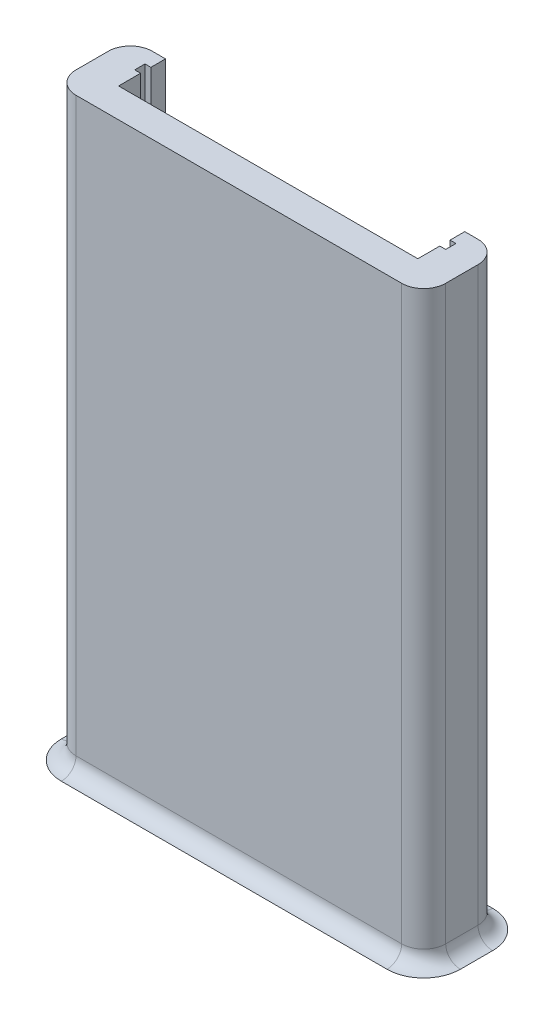
ISO-10303-21;
HEADER;
FILE_DESCRIPTION(('STEP AP214'),'2;1');
FILE_NAME('part.step','',(''),(''),'','','');
FILE_SCHEMA(('AUTOMOTIVE_DESIGN { 1 0 10303 214 1 1 1 1 }'));
ENDSEC;
DATA;
#1=APPLICATION_CONTEXT('core data for automotive mechanical design processes');
#2=APPLICATION_PROTOCOL_DEFINITION('international standard','automotive_design',2000,#1);
#3=PRODUCT_CONTEXT('',#1,'mechanical');
#4=PRODUCT('Part','Part','',(#3));
#5=PRODUCT_RELATED_PRODUCT_CATEGORY('part','',(#4));
#6=PRODUCT_DEFINITION_FORMATION('','',#4);
#7=PRODUCT_DEFINITION_CONTEXT('part definition',#1,'design');
#8=PRODUCT_DEFINITION('design','',#6,#7);
#9=PRODUCT_DEFINITION_SHAPE('','',#8);
#10=(LENGTH_UNIT() NAMED_UNIT(*) SI_UNIT(.MILLI.,.METRE.));
#11=(NAMED_UNIT(*) PLANE_ANGLE_UNIT() SI_UNIT($,.RADIAN.));
#12=(NAMED_UNIT(*) SI_UNIT($,.STERADIAN.) SOLID_ANGLE_UNIT());
#13=UNCERTAINTY_MEASURE_WITH_UNIT(LENGTH_MEASURE(1.E-05),#10,'distance_accuracy_value','');
#14=(GEOMETRIC_REPRESENTATION_CONTEXT(3) GLOBAL_UNCERTAINTY_ASSIGNED_CONTEXT((#13)) GLOBAL_UNIT_ASSIGNED_CONTEXT((#10,
#11,#12)) REPRESENTATION_CONTEXT('',''));
#15=CARTESIAN_POINT('',(0.,0.,0.));
#16=DIRECTION('',(0.,0.,1.));
#17=DIRECTION('',(1.,0.,0.));
#18=AXIS2_PLACEMENT_3D('',#15,#16,#17);
#19=CARTESIAN_POINT('',(0.,107.5944,0.));
#20=DIRECTION('',(0.,1.,0.));
#21=DIRECTION('',(0.,0.,1.));
#22=AXIS2_PLACEMENT_3D('',#19,#20,#21);
#23=PLANE('',#22);
#24=DIRECTION('',(0.,0.,1.));
#25=VECTOR('',#24,1.);
#26=CARTESIAN_POINT('',(12.446,107.5944,0.));
#27=LINE('',#26,#25);
#28=CARTESIAN_POINT('',(12.446,107.5944,-11.938));
#29=VERTEX_POINT('',#28);
#30=CARTESIAN_POINT('',(12.446,107.5944,-6.35));
#31=VERTEX_POINT('',#30);
#32=EDGE_CURVE('E868',#29,#31,#27,.T.);
#33=ORIENTED_EDGE('',*,*,#32,.T.);
#34=CARTESIAN_POINT('',(16.256,107.5944,-6.35));
#35=DIRECTION('',(0.,1.,0.));
#36=DIRECTION('',(0.,0.,1.));
#37=AXIS2_PLACEMENT_3D('',#34,#35,#36);
#38=CIRCLE('',#37,3.81);
#39=CARTESIAN_POINT('',(16.256,107.5944,-2.54));
#40=VERTEX_POINT('',#39);
#41=EDGE_CURVE('E418',#31,#40,#38,.T.);
#42=ORIENTED_EDGE('',*,*,#41,.T.);
#43=DIRECTION('',(1.,0.,0.));
#44=VECTOR('',#43,1.);
#45=CARTESIAN_POINT('',(0.,107.5944,-2.54));
#46=LINE('',#45,#44);
#47=CARTESIAN_POINT('',(72.644,107.5944,-2.54));
#48=VERTEX_POINT('',#47);
#49=EDGE_CURVE('E895',#40,#48,#46,.T.);
#50=ORIENTED_EDGE('',*,*,#49,.T.);
#51=CARTESIAN_POINT('',(72.644,107.5944,-6.35));
#52=DIRECTION('',(0.,1.,0.));
#53=DIRECTION('',(0.,0.,1.));
#54=AXIS2_PLACEMENT_3D('',#51,#52,#53);
#55=CIRCLE('',#54,3.81);
#56=CARTESIAN_POINT('',(76.454,107.5944,-6.35));
#57=VERTEX_POINT('',#56);
#58=EDGE_CURVE('E412',#48,#57,#55,.T.);
#59=ORIENTED_EDGE('',*,*,#58,.T.);
#60=DIRECTION('',(0.,0.,1.));
#61=VECTOR('',#60,1.);
#62=CARTESIAN_POINT('',(76.454,107.5944,0.));
#63=LINE('',#62,#61);
#64=CARTESIAN_POINT('',(76.454,107.5944,-11.938));
#65=VERTEX_POINT('',#64);
#66=EDGE_CURVE('E898',#65,#57,#63,.T.);
#67=ORIENTED_EDGE('',*,*,#66,.F.);
#68=CARTESIAN_POINT('',(72.644,107.5944,-11.938));
#69=DIRECTION('',(0.,1.,0.));
#70=DIRECTION('',(0.,0.,1.));
#71=AXIS2_PLACEMENT_3D('',#68,#69,#70);
#72=CIRCLE('',#71,3.81);
#73=CARTESIAN_POINT('',(72.644,107.5944,-15.748));
#74=VERTEX_POINT('',#73);
#75=EDGE_CURVE('E409',#65,#74,#72,.T.);
#76=ORIENTED_EDGE('',*,*,#75,.T.);
#77=DIRECTION('',(1.,0.,0.));
#78=VECTOR('',#77,1.);
#79=CARTESIAN_POINT('',(0.,107.5944,-15.748));
#80=LINE('',#79,#78);
#81=CARTESIAN_POINT('',(70.358,107.5944,-15.748));
#82=VERTEX_POINT('',#81);
#83=EDGE_CURVE('E892',#82,#74,#80,.T.);
#84=ORIENTED_EDGE('',*,*,#83,.F.);
#85=DIRECTION('',(0.,0.,-1.));
#86=VECTOR('',#85,1.);
#87=CARTESIAN_POINT('',(70.358,107.5944,0.));
#88=LINE('',#87,#86);
#89=CARTESIAN_POINT('',(70.358,107.5944,-13.208));
#90=VERTEX_POINT('',#89);
#91=EDGE_CURVE('E357',#90,#82,#88,.T.);
#92=ORIENTED_EDGE('',*,*,#91,.F.);
#93=DIRECTION('',(1.,0.,0.));
#94=VECTOR('',#93,1.);
#95=CARTESIAN_POINT('',(0.,107.5944,-13.208));
#96=LINE('',#95,#94);
#97=CARTESIAN_POINT('',(71.374,107.5944,-13.208));
#98=VERTEX_POINT('',#97);
#99=EDGE_CURVE('E876',#90,#98,#96,.T.);
#100=ORIENTED_EDGE('',*,*,#99,.T.);
#101=DIRECTION('',(0.,0.,1.));
#102=VECTOR('',#101,1.);
#103=CARTESIAN_POINT('',(71.374,107.5944,0.));
#104=LINE('',#103,#102);
#105=CARTESIAN_POINT('',(71.374,107.5944,-11.43));
#106=VERTEX_POINT('',#105);
#107=EDGE_CURVE('E919',#98,#106,#104,.T.);
#108=ORIENTED_EDGE('',*,*,#107,.T.);
#109=DIRECTION('',(1.,0.,0.));
#110=VECTOR('',#109,1.);
#111=CARTESIAN_POINT('',(0.,107.5944,-11.43));
#112=LINE('',#111,#110);
#113=CARTESIAN_POINT('',(70.358,107.5944,-11.43));
#114=VERTEX_POINT('',#113);
#115=EDGE_CURVE('E886',#114,#106,#112,.T.);
#116=ORIENTED_EDGE('',*,*,#115,.F.);
#117=CARTESIAN_POINT('',(70.358,107.5944,-7.62));
#118=VERTEX_POINT('',#117);
#119=EDGE_CURVE('E909',#118,#114,#88,.T.);
#120=ORIENTED_EDGE('',*,*,#119,.F.);
#121=DIRECTION('',(1.,0.,0.));
#122=VECTOR('',#121,1.);
#123=CARTESIAN_POINT('',(0.,107.5944,-7.62));
#124=LINE('',#123,#122);
#125=CARTESIAN_POINT('',(18.542,107.5944,-7.62));
#126=VERTEX_POINT('',#125);
#127=EDGE_CURVE('E913',#126,#118,#124,.T.);
#128=ORIENTED_EDGE('',*,*,#127,.F.);
#129=DIRECTION('',(0.,0.,-1.));
#130=VECTOR('',#129,1.);
#131=CARTESIAN_POINT('',(18.542,107.5944,0.));
#132=LINE('',#131,#130);
#133=CARTESIAN_POINT('',(18.542,107.5944,-11.43));
#134=VERTEX_POINT('',#133);
#135=EDGE_CURVE('E884',#126,#134,#132,.T.);
#136=ORIENTED_EDGE('',*,*,#135,.T.);
#137=CARTESIAN_POINT('',(17.526,107.5944,-11.43));
#138=VERTEX_POINT('',#137);
#139=EDGE_CURVE('E880',#138,#134,#112,.T.);
#140=ORIENTED_EDGE('',*,*,#139,.F.);
#141=DIRECTION('',(0.,0.,1.));
#142=VECTOR('',#141,1.);
#143=CARTESIAN_POINT('',(17.526,107.5944,0.));
#144=LINE('',#143,#142);
#145=CARTESIAN_POINT('',(17.526,107.5944,-13.208));
#146=VERTEX_POINT('',#145);
#147=EDGE_CURVE('E874',#146,#138,#144,.T.);
#148=ORIENTED_EDGE('',*,*,#147,.F.);
#149=CARTESIAN_POINT('',(18.542,107.5944,-13.208));
#150=VERTEX_POINT('',#149);
#151=EDGE_CURVE('E871',#146,#150,#96,.T.);
#152=ORIENTED_EDGE('',*,*,#151,.T.);
#153=CARTESIAN_POINT('',(18.542,107.5944,-15.748));
#154=VERTEX_POINT('',#153);
#155=EDGE_CURVE('E869',#150,#154,#132,.T.);
#156=ORIENTED_EDGE('',*,*,#155,.T.);
#157=CARTESIAN_POINT('',(16.256,107.5944,-15.748));
#158=VERTEX_POINT('',#157);
#159=EDGE_CURVE('E854',#158,#154,#80,.T.);
#160=ORIENTED_EDGE('',*,*,#159,.F.);
#161=CARTESIAN_POINT('',(16.256,107.5944,-11.938));
#162=DIRECTION('',(0.,1.,0.));
#163=DIRECTION('',(0.,0.,1.));
#164=AXIS2_PLACEMENT_3D('',#161,#162,#163);
#165=CIRCLE('',#164,3.81);
#166=EDGE_CURVE('E415',#158,#29,#165,.T.);
#167=ORIENTED_EDGE('',*,*,#166,.T.);
#168=EDGE_LOOP('',(#33,#42,#50,#59,#67,#76,#84,#92,#100,#108,#116,#120,#128,#136,#140,#148,#152,
#156,#160,#167));
#169=FACE_BOUND('',#168,.T.);
#170=ADVANCED_FACE('F46',(#169),#23,.T.);
#171=CARTESIAN_POINT('',(0.,107.5944,-15.748));
#172=DIRECTION('',(0.,0.,-1.));
#173=DIRECTION('',(-1.,0.,0.));
#174=AXIS2_PLACEMENT_3D('',#171,#172,#173);
#175=PLANE('',#174);
#176=DIRECTION('',(0.,-1.,0.));
#177=VECTOR('',#176,1.);
#178=CARTESIAN_POINT('',(72.644,107.5944,-15.748));
#179=LINE('',#178,#177);
#180=CARTESIAN_POINT('',(72.644,8.5344,-15.748));
#181=VERTEX_POINT('',#180);
#182=EDGE_CURVE('E430',#74,#181,#179,.T.);
#183=ORIENTED_EDGE('',*,*,#182,.T.);
#184=DIRECTION('',(1.,0.,0.));
#185=VECTOR('',#184,1.);
#186=CARTESIAN_POINT('',(0.,8.5344,-15.748));
#187=LINE('',#186,#185);
#188=CARTESIAN_POINT('',(70.358,8.5344,-15.748));
#189=VERTEX_POINT('',#188);
#190=EDGE_CURVE('E273',#181,#189,#187,.F.);
#191=ORIENTED_EDGE('',*,*,#190,.T.);
#192=DIRECTION('',(0.,-1.,0.));
#193=VECTOR('',#192,1.);
#194=CARTESIAN_POINT('',(70.358,107.5944,-15.748));
#195=LINE('',#194,#193);
#196=EDGE_CURVE('E356',#82,#189,#195,.T.);
#197=ORIENTED_EDGE('',*,*,#196,.F.);
#198=ORIENTED_EDGE('',*,*,#83,.T.);
#199=EDGE_LOOP('',(#183,#191,#197,#198));
#200=FACE_BOUND('',#199,.T.);
#201=ADVANCED_FACE('F454',(#200),#175,.T.);
#202=CARTESIAN_POINT('',(72.644,107.5944,-11.938));
#203=DIRECTION('',(0.,-1.,0.));
#204=DIRECTION('',(0.,0.,-1.));
#205=AXIS2_PLACEMENT_3D('',#202,#203,#204);
#206=CYLINDRICAL_SURFACE('',#205,3.81);
#207=DIRECTION('',(0.,-1.,0.));
#208=VECTOR('',#207,1.);
#209=CARTESIAN_POINT('',(76.454,107.5944,-11.938));
#210=LINE('',#209,#208);
#211=CARTESIAN_POINT('',(76.454,8.5344,-11.938));
#212=VERTEX_POINT('',#211);
#213=EDGE_CURVE('E424',#212,#65,#210,.F.);
#214=ORIENTED_EDGE('',*,*,#213,.F.);
#215=CARTESIAN_POINT('',(72.644,8.5344,-11.938));
#216=DIRECTION('',(0.,-1.,0.));
#217=DIRECTION('',(0.,0.,-1.));
#218=AXIS2_PLACEMENT_3D('',#215,#216,#217);
#219=CIRCLE('',#218,3.81);
#220=EDGE_CURVE('E276',#212,#181,#219,.F.);
#221=ORIENTED_EDGE('',*,*,#220,.T.);
#222=ORIENTED_EDGE('',*,*,#182,.F.);
#223=ORIENTED_EDGE('',*,*,#75,.F.);
#224=EDGE_LOOP('',(#214,#221,#222,#223));
#225=FACE_BOUND('',#224,.T.);
#226=ADVANCED_FACE('F460',(#225),#206,.T.);
#227=CARTESIAN_POINT('',(76.454,107.5944,0.));
#228=DIRECTION('',(1.,0.,0.));
#229=DIRECTION('',(0.,0.,-1.));
#230=AXIS2_PLACEMENT_3D('',#227,#228,#229);
#231=PLANE('',#230);
#232=DIRECTION('',(0.,-1.,0.));
#233=VECTOR('',#232,1.);
#234=CARTESIAN_POINT('',(76.454,5.9944,-6.35));
#235=LINE('',#234,#233);
#236=CARTESIAN_POINT('',(76.454,8.5344,-6.35));
#237=VERTEX_POINT('',#236);
#238=EDGE_CURVE('E427',#57,#237,#235,.T.);
#239=ORIENTED_EDGE('',*,*,#238,.T.);
#240=DIRECTION('',(0.,0.,1.));
#241=VECTOR('',#240,1.);
#242=CARTESIAN_POINT('',(76.454,8.5344,0.));
#243=LINE('',#242,#241);
#244=EDGE_CURVE('E279',#237,#212,#243,.F.);
#245=ORIENTED_EDGE('',*,*,#244,.T.);
#246=ORIENTED_EDGE('',*,*,#213,.T.);
#247=ORIENTED_EDGE('',*,*,#66,.T.);
#248=EDGE_LOOP('',(#239,#245,#246,#247));
#249=FACE_BOUND('',#248,.T.);
#250=ADVANCED_FACE('F474',(#249),#231,.T.);
#251=CARTESIAN_POINT('',(72.644,107.5944,-6.35));
#252=DIRECTION('',(0.,1.,0.));
#253=DIRECTION('',(0.,0.,1.));
#254=AXIS2_PLACEMENT_3D('',#251,#252,#253);
#255=CYLINDRICAL_SURFACE('',#254,3.81);
#256=DIRECTION('',(0.,-1.,0.));
#257=VECTOR('',#256,1.);
#258=CARTESIAN_POINT('',(72.644,107.5944,-2.54));
#259=LINE('',#258,#257);
#260=CARTESIAN_POINT('',(72.644,8.5344,-2.54));
#261=VERTEX_POINT('',#260);
#262=EDGE_CURVE('E229',#261,#48,#259,.F.);
#263=ORIENTED_EDGE('',*,*,#262,.F.);
#264=CARTESIAN_POINT('',(72.644,8.5344,-6.35));
#265=DIRECTION('',(0.,-1.,0.));
#266=DIRECTION('',(0.,0.,-1.));
#267=AXIS2_PLACEMENT_3D('',#264,#265,#266);
#268=CIRCLE('',#267,3.81);
#269=EDGE_CURVE('E71',#261,#237,#268,.F.);
#270=ORIENTED_EDGE('',*,*,#269,.T.);
#271=ORIENTED_EDGE('',*,*,#238,.F.);
#272=ORIENTED_EDGE('',*,*,#58,.F.);
#273=EDGE_LOOP('',(#263,#270,#271,#272));
#274=FACE_BOUND('',#273,.T.);
#275=ADVANCED_FACE('F477',(#274),#255,.T.);
#276=CARTESIAN_POINT('',(0.,107.5944,-2.54));
#277=DIRECTION('',(0.,0.,-1.));
#278=DIRECTION('',(-1.,0.,0.));
#279=AXIS2_PLACEMENT_3D('',#276,#277,#278);
#280=PLANE('',#279);
#281=DIRECTION('',(0.,-1.,0.));
#282=VECTOR('',#281,1.);
#283=CARTESIAN_POINT('',(16.256,107.5944,-2.54));
#284=LINE('',#283,#282);
#285=CARTESIAN_POINT('',(16.256,8.5344,-2.54));
#286=VERTEX_POINT('',#285);
#287=EDGE_CURVE('E399',#40,#286,#284,.T.);
#288=ORIENTED_EDGE('',*,*,#287,.T.);
#289=DIRECTION('',(1.,0.,0.));
#290=VECTOR('',#289,1.);
#291=CARTESIAN_POINT('',(72.644,8.5344,-2.54));
#292=LINE('',#291,#290);
#293=EDGE_CURVE('E64',#286,#261,#292,.T.);
#294=ORIENTED_EDGE('',*,*,#293,.T.);
#295=ORIENTED_EDGE('',*,*,#262,.T.);
#296=ORIENTED_EDGE('',*,*,#49,.F.);
#297=EDGE_LOOP('',(#288,#294,#295,#296));
#298=FACE_BOUND('',#297,.T.);
#299=ADVANCED_FACE('F479',(#298),#280,.F.);
#300=CARTESIAN_POINT('',(16.256,107.5944,-6.35));
#301=DIRECTION('',(0.,-1.,0.));
#302=DIRECTION('',(0.,0.,-1.));
#303=AXIS2_PLACEMENT_3D('',#300,#301,#302);
#304=CYLINDRICAL_SURFACE('',#303,3.81);
#305=DIRECTION('',(0.,-1.,0.));
#306=VECTOR('',#305,1.);
#307=CARTESIAN_POINT('',(12.446,107.5944,-6.35));
#308=LINE('',#307,#306);
#309=CARTESIAN_POINT('',(12.446,8.5344,-6.35));
#310=VERTEX_POINT('',#309);
#311=EDGE_CURVE('E406',#310,#31,#308,.F.);
#312=ORIENTED_EDGE('',*,*,#311,.F.);
#313=CARTESIAN_POINT('',(16.256,8.5344,-6.35));
#314=DIRECTION('',(0.,-1.,0.));
#315=DIRECTION('',(0.,0.,-1.));
#316=AXIS2_PLACEMENT_3D('',#313,#314,#315);
#317=CIRCLE('',#316,3.81);
#318=EDGE_CURVE('E270',#310,#286,#317,.F.);
#319=ORIENTED_EDGE('',*,*,#318,.T.);
#320=ORIENTED_EDGE('',*,*,#287,.F.);
#321=ORIENTED_EDGE('',*,*,#41,.F.);
#322=EDGE_LOOP('',(#312,#319,#320,#321));
#323=FACE_BOUND('',#322,.T.);
#324=ADVANCED_FACE('F482',(#323),#304,.T.);
#325=CARTESIAN_POINT('',(12.446,107.5944,0.));
#326=DIRECTION('',(1.,0.,0.));
#327=DIRECTION('',(0.,0.,-1.));
#328=AXIS2_PLACEMENT_3D('',#325,#326,#327);
#329=PLANE('',#328);
#330=DIRECTION('',(0.,-1.,0.));
#331=VECTOR('',#330,1.);
#332=CARTESIAN_POINT('',(12.446,5.9944,-11.938));
#333=LINE('',#332,#331);
#334=CARTESIAN_POINT('',(12.446,8.5344,-11.938));
#335=VERTEX_POINT('',#334);
#336=EDGE_CURVE('E402',#29,#335,#333,.T.);
#337=ORIENTED_EDGE('',*,*,#336,.T.);
#338=DIRECTION('',(0.,0.,1.));
#339=VECTOR('',#338,1.);
#340=CARTESIAN_POINT('',(12.446,8.5344,-6.35));
#341=LINE('',#340,#339);
#342=EDGE_CURVE('E267',#335,#310,#341,.T.);
#343=ORIENTED_EDGE('',*,*,#342,.T.);
#344=ORIENTED_EDGE('',*,*,#311,.T.);
#345=ORIENTED_EDGE('',*,*,#32,.F.);
#346=EDGE_LOOP('',(#337,#343,#344,#345));
#347=FACE_BOUND('',#346,.T.);
#348=ADVANCED_FACE('F483',(#347),#329,.F.);
#349=CARTESIAN_POINT('',(16.256,107.5944,-11.938));
#350=DIRECTION('',(0.,1.,0.));
#351=DIRECTION('',(0.,0.,1.));
#352=AXIS2_PLACEMENT_3D('',#349,#350,#351);
#353=CYLINDRICAL_SURFACE('',#352,3.81);
#354=DIRECTION('',(0.,-1.,0.));
#355=VECTOR('',#354,1.);
#356=CARTESIAN_POINT('',(16.256,107.5944,-15.748));
#357=LINE('',#356,#355);
#358=CARTESIAN_POINT('',(16.256,8.5344,-15.748));
#359=VERTEX_POINT('',#358);
#360=EDGE_CURVE('E421',#359,#158,#357,.F.);
#361=ORIENTED_EDGE('',*,*,#360,.F.);
#362=CARTESIAN_POINT('',(16.256,8.5344,-11.938));
#363=DIRECTION('',(0.,-1.,0.));
#364=DIRECTION('',(0.,0.,-1.));
#365=AXIS2_PLACEMENT_3D('',#362,#363,#364);
#366=CIRCLE('',#365,3.81);
#367=EDGE_CURVE('E264',#359,#335,#366,.F.);
#368=ORIENTED_EDGE('',*,*,#367,.T.);
#369=ORIENTED_EDGE('',*,*,#336,.F.);
#370=ORIENTED_EDGE('',*,*,#166,.F.);
#371=EDGE_LOOP('',(#361,#368,#369,#370));
#372=FACE_BOUND('',#371,.T.);
#373=ADVANCED_FACE('F486',(#372),#353,.T.);
#374=DIRECTION('',(0.,-1.,0.));
#375=VECTOR('',#374,1.);
#376=CARTESIAN_POINT('',(18.542,107.5944,-15.748));
#377=LINE('',#376,#375);
#378=CARTESIAN_POINT('',(18.542,8.5344,-15.748));
#379=VERTEX_POINT('',#378);
#380=EDGE_CURVE('E361',#154,#379,#377,.T.);
#381=ORIENTED_EDGE('',*,*,#380,.T.);
#382=DIRECTION('',(1.,0.,0.));
#383=VECTOR('',#382,1.);
#384=CARTESIAN_POINT('',(0.,8.5344,-15.748));
#385=LINE('',#384,#383);
#386=EDGE_CURVE('E261',#379,#359,#385,.F.);
#387=ORIENTED_EDGE('',*,*,#386,.T.);
#388=ORIENTED_EDGE('',*,*,#360,.T.);
#389=ORIENTED_EDGE('',*,*,#159,.T.);
#390=EDGE_LOOP('',(#381,#387,#388,#389));
#391=FACE_BOUND('',#390,.T.);
#392=ADVANCED_FACE('F463',(#391),#175,.T.);
#393=CARTESIAN_POINT('',(0.,8.5344,-18.288));
#394=DIRECTION('',(1.,0.,0.));
#395=DIRECTION('',(0.,0.,-1.));
#396=AXIS2_PLACEMENT_3D('',#393,#394,#395);
#397=CYLINDRICAL_SURFACE('',#396,2.54);
#398=CARTESIAN_POINT('',(16.256,8.5344,-18.288));
#399=DIRECTION('',(-1.,0.,0.));
#400=DIRECTION('',(0.,0.,1.));
#401=AXIS2_PLACEMENT_3D('',#398,#399,#400);
#402=CIRCLE('',#401,2.54);
#403=CARTESIAN_POINT('',(16.256,5.9944,-18.288));
#404=VERTEX_POINT('',#403);
#405=EDGE_CURVE('E288',#404,#359,#402,.T.);
#406=ORIENTED_EDGE('',*,*,#405,.T.);
#407=ORIENTED_EDGE('',*,*,#386,.F.);
#408=CARTESIAN_POINT('',(18.542,8.5344,-18.288));
#409=DIRECTION('',(-1.,0.,0.));
#410=DIRECTION('',(0.,0.,1.));
#411=AXIS2_PLACEMENT_3D('',#408,#409,#410);
#412=CIRCLE('',#411,2.54);
#413=CARTESIAN_POINT('',(18.542,5.9944,-18.288));
#414=VERTEX_POINT('',#413);
#415=EDGE_CURVE('E56',#414,#379,#412,.T.);
#416=ORIENTED_EDGE('',*,*,#415,.F.);
#417=DIRECTION('',(1.,0.,0.));
#418=VECTOR('',#417,1.);
#419=CARTESIAN_POINT('',(0.,5.9944,-18.288));
#420=LINE('',#419,#418);
#421=EDGE_CURVE('E258',#404,#414,#420,.T.);
#422=ORIENTED_EDGE('',*,*,#421,.F.);
#423=EDGE_LOOP('',(#406,#407,#416,#422));
#424=FACE_BOUND('',#423,.T.);
#425=ADVANCED_FACE('F524',(#424),#397,.F.);
#426=CARTESIAN_POINT('',(16.256,8.5344,-11.938));
#427=DIRECTION('',(0.,-1.,0.));
#428=DIRECTION('',(0.,0.,-1.));
#429=AXIS2_PLACEMENT_3D('',#426,#427,#428);
#430=TOROIDAL_SURFACE('',#429,6.35,2.54);
#431=CARTESIAN_POINT('',(9.906,8.5344,-11.938));
#432=DIRECTION('',(0.,0.,1.));
#433=DIRECTION('',(1.,0.,0.));
#434=AXIS2_PLACEMENT_3D('',#431,#432,#433);
#435=CIRCLE('',#434,2.54);
#436=CARTESIAN_POINT('',(9.906,5.9944,-11.938));
#437=VERTEX_POINT('',#436);
#438=EDGE_CURVE('E292',#437,#335,#435,.T.);
#439=ORIENTED_EDGE('',*,*,#438,.T.);
#440=ORIENTED_EDGE('',*,*,#367,.F.);
#441=ORIENTED_EDGE('',*,*,#405,.F.);
#442=CARTESIAN_POINT('',(16.256,5.9944,-11.938));
#443=DIRECTION('',(0.,-1.,0.));
#444=DIRECTION('',(0.,0.,-1.));
#445=AXIS2_PLACEMENT_3D('',#442,#443,#444);
#446=CIRCLE('',#445,6.35);
#447=EDGE_CURVE('E250',#437,#404,#446,.T.);
#448=ORIENTED_EDGE('',*,*,#447,.F.);
#449=EDGE_LOOP('',(#439,#440,#441,#448));
#450=FACE_BOUND('',#449,.T.);
#451=ADVANCED_FACE('F527',(#450),#430,.F.);
#452=CARTESIAN_POINT('',(9.906,8.5344,0.));
#453=DIRECTION('',(0.,0.,-1.));
#454=DIRECTION('',(-1.,0.,0.));
#455=AXIS2_PLACEMENT_3D('',#452,#453,#454);
#456=CYLINDRICAL_SURFACE('',#455,2.54);
#457=CARTESIAN_POINT('',(9.906,8.5344,-6.35));
#458=DIRECTION('',(0.,0.,1.));
#459=DIRECTION('',(1.,0.,0.));
#460=AXIS2_PLACEMENT_3D('',#457,#458,#459);
#461=CIRCLE('',#460,2.54);
#462=CARTESIAN_POINT('',(9.906,5.9944,-6.35));
#463=VERTEX_POINT('',#462);
#464=EDGE_CURVE('E239',#463,#310,#461,.T.);
#465=ORIENTED_EDGE('',*,*,#464,.T.);
#466=ORIENTED_EDGE('',*,*,#342,.F.);
#467=ORIENTED_EDGE('',*,*,#438,.F.);
#468=DIRECTION('',(0.,0.,1.));
#469=VECTOR('',#468,1.);
#470=CARTESIAN_POINT('',(9.906,5.9944,-11.938));
#471=LINE('',#470,#469);
#472=EDGE_CURVE('E245',#463,#437,#471,.F.);
#473=ORIENTED_EDGE('',*,*,#472,.F.);
#474=EDGE_LOOP('',(#465,#466,#467,#473));
#475=FACE_BOUND('',#474,.T.);
#476=ADVANCED_FACE('F531',(#475),#456,.F.);
#477=CARTESIAN_POINT('',(16.256,8.5344,-6.35));
#478=DIRECTION('',(0.,-1.,0.));
#479=DIRECTION('',(0.,0.,-1.));
#480=AXIS2_PLACEMENT_3D('',#477,#478,#479);
#481=TOROIDAL_SURFACE('',#480,6.35,2.54);
#482=CARTESIAN_POINT('',(16.256,8.5344,0.));
#483=DIRECTION('',(1.,0.,0.));
#484=DIRECTION('',(0.,0.,-1.));
#485=AXIS2_PLACEMENT_3D('',#482,#483,#484);
#486=CIRCLE('',#485,2.54);
#487=CARTESIAN_POINT('',(16.256,5.9944,0.));
#488=VERTEX_POINT('',#487);
#489=EDGE_CURVE('E233',#488,#286,#486,.T.);
#490=ORIENTED_EDGE('',*,*,#489,.T.);
#491=ORIENTED_EDGE('',*,*,#318,.F.);
#492=ORIENTED_EDGE('',*,*,#464,.F.);
#493=CARTESIAN_POINT('',(16.256,5.9944,-6.35));
#494=DIRECTION('',(0.,-1.,0.));
#495=DIRECTION('',(0.,0.,-1.));
#496=AXIS2_PLACEMENT_3D('',#493,#494,#495);
#497=CIRCLE('',#496,6.35);
#498=EDGE_CURVE('E221',#488,#463,#497,.T.);
#499=ORIENTED_EDGE('',*,*,#498,.F.);
#500=EDGE_LOOP('',(#490,#491,#492,#499));
#501=FACE_BOUND('',#500,.T.);
#502=ADVANCED_FACE('F241',(#501),#481,.F.);
#503=CARTESIAN_POINT('',(0.,8.5344,0.));
#504=DIRECTION('',(-1.,0.,0.));
#505=DIRECTION('',(0.,0.,1.));
#506=AXIS2_PLACEMENT_3D('',#503,#504,#505);
#507=CYLINDRICAL_SURFACE('',#506,2.54);
#508=CARTESIAN_POINT('',(72.644,8.5344,0.));
#509=DIRECTION('',(1.,0.,0.));
#510=DIRECTION('',(0.,0.,-1.));
#511=AXIS2_PLACEMENT_3D('',#508,#509,#510);
#512=CIRCLE('',#511,2.54);
#513=CARTESIAN_POINT('',(72.644,5.99440000000001,0.));
#514=VERTEX_POINT('',#513);
#515=EDGE_CURVE('E238',#514,#261,#512,.T.);
#516=ORIENTED_EDGE('',*,*,#515,.T.);
#517=ORIENTED_EDGE('',*,*,#293,.F.);
#518=ORIENTED_EDGE('',*,*,#489,.F.);
#519=DIRECTION('',(1.,0.,0.));
#520=VECTOR('',#519,1.);
#521=CARTESIAN_POINT('',(0.,5.9944,0.));
#522=LINE('',#521,#520);
#523=EDGE_CURVE('E217',#488,#514,#522,.T.);
#524=ORIENTED_EDGE('',*,*,#523,.T.);
#525=EDGE_LOOP('',(#516,#517,#518,#524));
#526=FACE_BOUND('',#525,.T.);
#527=ADVANCED_FACE('F234',(#526),#507,.F.);
#528=CARTESIAN_POINT('',(72.644,8.5344,-6.35));
#529=DIRECTION('',(0.,-1.,0.));
#530=DIRECTION('',(0.,0.,-1.));
#531=AXIS2_PLACEMENT_3D('',#528,#529,#530);
#532=TOROIDAL_SURFACE('',#531,6.35,2.54);
#533=CARTESIAN_POINT('',(78.994,8.5344,-6.35));
#534=DIRECTION('',(0.,0.,-1.));
#535=DIRECTION('',(-1.,0.,0.));
#536=AXIS2_PLACEMENT_3D('',#533,#534,#535);
#537=CIRCLE('',#536,2.54);
#538=CARTESIAN_POINT('',(78.994,5.9944,-6.35));
#539=VERTEX_POINT('',#538);
#540=EDGE_CURVE('E301',#539,#237,#537,.T.);
#541=ORIENTED_EDGE('',*,*,#540,.T.);
#542=ORIENTED_EDGE('',*,*,#269,.F.);
#543=ORIENTED_EDGE('',*,*,#515,.F.);
#544=CARTESIAN_POINT('',(72.644,5.9944,-6.35));
#545=DIRECTION('',(0.,-1.,0.));
#546=DIRECTION('',(0.,0.,-1.));
#547=AXIS2_PLACEMENT_3D('',#544,#545,#546);
#548=CIRCLE('',#547,6.35);
#549=EDGE_CURVE('E224',#539,#514,#548,.T.);
#550=ORIENTED_EDGE('',*,*,#549,.F.);
#551=EDGE_LOOP('',(#541,#542,#543,#550));
#552=FACE_BOUND('',#551,.T.);
#553=ADVANCED_FACE('F444',(#552),#532,.F.);
#554=CARTESIAN_POINT('',(78.994,8.5344,0.));
#555=DIRECTION('',(0.,0.,1.));
#556=DIRECTION('',(1.,0.,0.));
#557=AXIS2_PLACEMENT_3D('',#554,#555,#556);
#558=CYLINDRICAL_SURFACE('',#557,2.54);
#559=CARTESIAN_POINT('',(78.994,8.5344,-11.938));
#560=DIRECTION('',(0.,0.,-1.));
#561=DIRECTION('',(-1.,0.,0.));
#562=AXIS2_PLACEMENT_3D('',#559,#560,#561);
#563=CIRCLE('',#562,2.54);
#564=CARTESIAN_POINT('',(78.994,5.9944,-11.938));
#565=VERTEX_POINT('',#564);
#566=EDGE_CURVE('E304',#565,#212,#563,.T.);
#567=ORIENTED_EDGE('',*,*,#566,.T.);
#568=ORIENTED_EDGE('',*,*,#244,.F.);
#569=ORIENTED_EDGE('',*,*,#540,.F.);
#570=DIRECTION('',(0.,0.,1.));
#571=VECTOR('',#570,1.);
#572=CARTESIAN_POINT('',(78.994,5.9944,0.));
#573=LINE('',#572,#571);
#574=EDGE_CURVE('E436',#565,#539,#573,.T.);
#575=ORIENTED_EDGE('',*,*,#574,.F.);
#576=EDGE_LOOP('',(#567,#568,#569,#575));
#577=FACE_BOUND('',#576,.T.);
#578=ADVANCED_FACE('F442',(#577),#558,.F.);
#579=CARTESIAN_POINT('',(72.644,8.5344,-11.938));
#580=DIRECTION('',(0.,-1.,0.));
#581=DIRECTION('',(0.,0.,-1.));
#582=AXIS2_PLACEMENT_3D('',#579,#580,#581);
#583=TOROIDAL_SURFACE('',#582,6.35,2.54);
#584=CARTESIAN_POINT('',(72.644,8.5344,-18.288));
#585=DIRECTION('',(-1.,0.,0.));
#586=DIRECTION('',(0.,0.,1.));
#587=AXIS2_PLACEMENT_3D('',#584,#585,#586);
#588=CIRCLE('',#587,2.54);
#589=CARTESIAN_POINT('',(72.644,5.9944,-18.288));
#590=VERTEX_POINT('',#589);
#591=EDGE_CURVE('E50',#590,#181,#588,.T.);
#592=ORIENTED_EDGE('',*,*,#591,.T.);
#593=ORIENTED_EDGE('',*,*,#220,.F.);
#594=ORIENTED_EDGE('',*,*,#566,.F.);
#595=CARTESIAN_POINT('',(72.644,5.9944,-11.938));
#596=DIRECTION('',(0.,-1.,0.));
#597=DIRECTION('',(0.,0.,-1.));
#598=AXIS2_PLACEMENT_3D('',#595,#596,#597);
#599=CIRCLE('',#598,6.35);
#600=EDGE_CURVE('E252',#590,#565,#599,.T.);
#601=ORIENTED_EDGE('',*,*,#600,.F.);
#602=EDGE_LOOP('',(#592,#593,#594,#601));
#603=FACE_BOUND('',#602,.T.);
#604=ADVANCED_FACE('F441',(#603),#583,.F.);
#605=CARTESIAN_POINT('',(0.,8.5344,-18.288));
#606=DIRECTION('',(1.,0.,0.));
#607=DIRECTION('',(0.,0.,-1.));
#608=AXIS2_PLACEMENT_3D('',#605,#606,#607);
#609=CYLINDRICAL_SURFACE('',#608,2.54);
#610=CARTESIAN_POINT('',(70.358,8.5344,-18.288));
#611=DIRECTION('',(-1.,0.,0.));
#612=DIRECTION('',(0.,0.,1.));
#613=AXIS2_PLACEMENT_3D('',#610,#611,#612);
#614=CIRCLE('',#613,2.54);
#615=CARTESIAN_POINT('',(70.358,5.9944,-18.288));
#616=VERTEX_POINT('',#615);
#617=EDGE_CURVE('E11',#189,#616,#614,.F.);
#618=ORIENTED_EDGE('',*,*,#617,.F.);
#619=ORIENTED_EDGE('',*,*,#190,.F.);
#620=ORIENTED_EDGE('',*,*,#591,.F.);
#621=DIRECTION('',(1.,0.,0.));
#622=VECTOR('',#621,1.);
#623=CARTESIAN_POINT('',(0.,5.9944,-18.288));
#624=LINE('',#623,#622);
#625=EDGE_CURVE('E246',#616,#590,#624,.T.);
#626=ORIENTED_EDGE('',*,*,#625,.F.);
#627=EDGE_LOOP('',(#618,#619,#620,#626));
#628=FACE_BOUND('',#627,.T.);
#629=ADVANCED_FACE('F48',(#628),#609,.F.);
#630=CARTESIAN_POINT('',(70.358,107.5944,0.));
#631=DIRECTION('',(-1.,0.,0.));
#632=DIRECTION('',(0.,0.,1.));
#633=AXIS2_PLACEMENT_3D('',#630,#631,#632);
#634=PLANE('',#633);
#635=DIRECTION('',(0.,0.,-1.));
#636=VECTOR('',#635,1.);
#637=CARTESIAN_POINT('',(70.358,5.9944,0.));
#638=LINE('',#637,#636);
#639=CARTESIAN_POINT('',(70.358,5.9944,-13.208));
#640=VERTEX_POINT('',#639);
#641=EDGE_CURVE('E342',#640,#616,#638,.T.);
#642=ORIENTED_EDGE('',*,*,#641,.F.);
#643=DIRECTION('',(0.,-1.,0.));
#644=VECTOR('',#643,1.);
#645=CARTESIAN_POINT('',(70.358,107.5944,-13.208));
#646=LINE('',#645,#644);
#647=EDGE_CURVE('E353',#90,#640,#646,.T.);
#648=ORIENTED_EDGE('',*,*,#647,.F.);
#649=ORIENTED_EDGE('',*,*,#91,.T.);
#650=ORIENTED_EDGE('',*,*,#196,.T.);
#651=ORIENTED_EDGE('',*,*,#617,.T.);
#652=EDGE_LOOP('',(#642,#648,#649,#650,#651));
#653=FACE_BOUND('',#652,.T.);
#654=ADVANCED_FACE('F468',(#653),#634,.T.);
#655=CARTESIAN_POINT('',(18.542,107.5944,0.));
#656=DIRECTION('',(-1.,0.,0.));
#657=DIRECTION('',(0.,0.,1.));
#658=AXIS2_PLACEMENT_3D('',#655,#656,#657);
#659=PLANE('',#658);
#660=DIRECTION('',(0.,0.,-1.));
#661=VECTOR('',#660,1.);
#662=CARTESIAN_POINT('',(18.542,5.9944,0.));
#663=LINE('',#662,#661);
#664=CARTESIAN_POINT('',(18.542,5.9944,-13.208));
#665=VERTEX_POINT('',#664);
#666=EDGE_CURVE('E333',#665,#414,#663,.T.);
#667=ORIENTED_EDGE('',*,*,#666,.T.);
#668=ORIENTED_EDGE('',*,*,#415,.T.);
#669=ORIENTED_EDGE('',*,*,#380,.F.);
#670=ORIENTED_EDGE('',*,*,#155,.F.);
#671=DIRECTION('',(0.,-1.,0.));
#672=VECTOR('',#671,1.);
#673=CARTESIAN_POINT('',(18.542,107.5944,-13.208));
#674=LINE('',#673,#672);
#675=EDGE_CURVE('E365',#150,#665,#674,.T.);
#676=ORIENTED_EDGE('',*,*,#675,.T.);
#677=EDGE_LOOP('',(#667,#668,#669,#670,#676));
#678=FACE_BOUND('',#677,.T.);
#679=ADVANCED_FACE('F470',(#678),#659,.F.);
#680=CARTESIAN_POINT('',(0.,107.5944,-13.208));
#681=DIRECTION('',(0.,0.,-1.));
#682=DIRECTION('',(-1.,0.,0.));
#683=AXIS2_PLACEMENT_3D('',#680,#681,#682);
#684=PLANE('',#683);
#685=DIRECTION('',(1.,0.,0.));
#686=VECTOR('',#685,1.);
#687=CARTESIAN_POINT('',(0.,5.9944,-13.208));
#688=LINE('',#687,#686);
#689=CARTESIAN_POINT('',(17.526,5.9944,-13.208));
#690=VERTEX_POINT('',#689);
#691=EDGE_CURVE('E322',#690,#665,#688,.T.);
#692=ORIENTED_EDGE('',*,*,#691,.T.);
#693=ORIENTED_EDGE('',*,*,#675,.F.);
#694=ORIENTED_EDGE('',*,*,#151,.F.);
#695=DIRECTION('',(0.,-1.,0.));
#696=VECTOR('',#695,1.);
#697=CARTESIAN_POINT('',(17.526,107.5944,-13.208));
#698=LINE('',#697,#696);
#699=EDGE_CURVE('E368',#146,#690,#698,.T.);
#700=ORIENTED_EDGE('',*,*,#699,.T.);
#701=EDGE_LOOP('',(#692,#693,#694,#700));
#702=FACE_BOUND('',#701,.T.);
#703=ADVANCED_FACE('F490',(#702),#684,.F.);
#704=CARTESIAN_POINT('',(17.526,107.5944,0.));
#705=DIRECTION('',(1.,0.,0.));
#706=DIRECTION('',(0.,0.,-1.));
#707=AXIS2_PLACEMENT_3D('',#704,#705,#706);
#708=PLANE('',#707);
#709=DIRECTION('',(0.,0.,1.));
#710=VECTOR('',#709,1.);
#711=CARTESIAN_POINT('',(17.526,5.9944,0.));
#712=LINE('',#711,#710);
#713=CARTESIAN_POINT('',(17.526,5.9944,-11.43));
#714=VERTEX_POINT('',#713);
#715=EDGE_CURVE('E334',#690,#714,#712,.T.);
#716=ORIENTED_EDGE('',*,*,#715,.F.);
#717=ORIENTED_EDGE('',*,*,#699,.F.);
#718=ORIENTED_EDGE('',*,*,#147,.T.);
#719=DIRECTION('',(0.,-1.,0.));
#720=VECTOR('',#719,1.);
#721=CARTESIAN_POINT('',(17.526,107.5944,-11.43));
#722=LINE('',#721,#720);
#723=EDGE_CURVE('E371',#138,#714,#722,.T.);
#724=ORIENTED_EDGE('',*,*,#723,.T.);
#725=EDGE_LOOP('',(#716,#717,#718,#724));
#726=FACE_BOUND('',#725,.T.);
#727=ADVANCED_FACE('F495',(#726),#708,.T.);
#728=CARTESIAN_POINT('',(0.,107.5944,-11.43));
#729=DIRECTION('',(0.,0.,-1.));
#730=DIRECTION('',(-1.,0.,0.));
#731=AXIS2_PLACEMENT_3D('',#728,#729,#730);
#732=PLANE('',#731);
#733=DIRECTION('',(1.,0.,0.));
#734=VECTOR('',#733,1.);
#735=CARTESIAN_POINT('',(0.,5.9944,-11.43));
#736=LINE('',#735,#734);
#737=CARTESIAN_POINT('',(18.542,5.9944,-11.43));
#738=VERTEX_POINT('',#737);
#739=EDGE_CURVE('E345',#714,#738,#736,.T.);
#740=ORIENTED_EDGE('',*,*,#739,.F.);
#741=ORIENTED_EDGE('',*,*,#723,.F.);
#742=ORIENTED_EDGE('',*,*,#139,.T.);
#743=DIRECTION('',(0.,-1.,0.));
#744=VECTOR('',#743,1.);
#745=CARTESIAN_POINT('',(18.542,107.5944,-11.43));
#746=LINE('',#745,#744);
#747=EDGE_CURVE('E374',#134,#738,#746,.T.);
#748=ORIENTED_EDGE('',*,*,#747,.T.);
#749=EDGE_LOOP('',(#740,#741,#742,#748));
#750=FACE_BOUND('',#749,.T.);
#751=ADVANCED_FACE('F499',(#750),#732,.T.);
#752=CARTESIAN_POINT('',(18.542,5.9944,-7.62));
#753=VERTEX_POINT('',#752);
#754=EDGE_CURVE('E344',#753,#738,#663,.T.);
#755=ORIENTED_EDGE('',*,*,#754,.T.);
#756=ORIENTED_EDGE('',*,*,#747,.F.);
#757=ORIENTED_EDGE('',*,*,#135,.F.);
#758=DIRECTION('',(0.,-1.,0.));
#759=VECTOR('',#758,1.);
#760=CARTESIAN_POINT('',(18.542,107.5944,-7.62));
#761=LINE('',#760,#759);
#762=EDGE_CURVE('E378',#126,#753,#761,.T.);
#763=ORIENTED_EDGE('',*,*,#762,.T.);
#764=EDGE_LOOP('',(#755,#756,#757,#763));
#765=FACE_BOUND('',#764,.T.);
#766=ADVANCED_FACE('F492',(#765),#659,.F.);
#767=CARTESIAN_POINT('',(0.,107.5944,-7.62));
#768=DIRECTION('',(0.,0.,-1.));
#769=DIRECTION('',(-1.,0.,0.));
#770=AXIS2_PLACEMENT_3D('',#767,#768,#769);
#771=PLANE('',#770);
#772=DIRECTION('',(1.,0.,0.));
#773=VECTOR('',#772,1.);
#774=CARTESIAN_POINT('',(0.,5.9944,-7.62));
#775=LINE('',#774,#773);
#776=CARTESIAN_POINT('',(70.358,5.9944,-7.62));
#777=VERTEX_POINT('',#776);
#778=EDGE_CURVE('E953',#753,#777,#775,.T.);
#779=ORIENTED_EDGE('',*,*,#778,.F.);
#780=ORIENTED_EDGE('',*,*,#762,.F.);
#781=ORIENTED_EDGE('',*,*,#127,.T.);
#782=DIRECTION('',(0.,-1.,0.));
#783=VECTOR('',#782,1.);
#784=CARTESIAN_POINT('',(70.358,107.5944,-7.62));
#785=LINE('',#784,#783);
#786=EDGE_CURVE('E382',#118,#777,#785,.T.);
#787=ORIENTED_EDGE('',*,*,#786,.T.);
#788=EDGE_LOOP('',(#779,#780,#781,#787));
#789=FACE_BOUND('',#788,.T.);
#790=ADVANCED_FACE('F505',(#789),#771,.T.);
#791=CARTESIAN_POINT('',(70.358,5.9944,-11.43));
#792=VERTEX_POINT('',#791);
#793=EDGE_CURVE('E950',#777,#792,#638,.T.);
#794=ORIENTED_EDGE('',*,*,#793,.F.);
#795=ORIENTED_EDGE('',*,*,#786,.F.);
#796=ORIENTED_EDGE('',*,*,#119,.T.);
#797=DIRECTION('',(0.,-1.,0.));
#798=VECTOR('',#797,1.);
#799=CARTESIAN_POINT('',(70.358,107.5944,-11.43));
#800=LINE('',#799,#798);
#801=EDGE_CURVE('E386',#114,#792,#800,.T.);
#802=ORIENTED_EDGE('',*,*,#801,.T.);
#803=EDGE_LOOP('',(#794,#795,#796,#802));
#804=FACE_BOUND('',#803,.T.);
#805=ADVANCED_FACE('F472',(#804),#634,.T.);
#806=CARTESIAN_POINT('',(71.374,5.9944,-11.43));
#807=VERTEX_POINT('',#806);
#808=EDGE_CURVE('E328',#792,#807,#736,.T.);
#809=ORIENTED_EDGE('',*,*,#808,.F.);
#810=ORIENTED_EDGE('',*,*,#801,.F.);
#811=ORIENTED_EDGE('',*,*,#115,.T.);
#812=DIRECTION('',(0.,-1.,0.));
#813=VECTOR('',#812,1.);
#814=CARTESIAN_POINT('',(71.374,107.5944,-11.43));
#815=LINE('',#814,#813);
#816=EDGE_CURVE('E390',#106,#807,#815,.T.);
#817=ORIENTED_EDGE('',*,*,#816,.T.);
#818=EDGE_LOOP('',(#809,#810,#811,#817));
#819=FACE_BOUND('',#818,.T.);
#820=ADVANCED_FACE('F504',(#819),#732,.T.);
#821=CARTESIAN_POINT('',(71.374,107.5944,0.));
#822=DIRECTION('',(1.,0.,0.));
#823=DIRECTION('',(0.,0.,-1.));
#824=AXIS2_PLACEMENT_3D('',#821,#822,#823);
#825=PLANE('',#824);
#826=DIRECTION('',(0.,0.,1.));
#827=VECTOR('',#826,1.);
#828=CARTESIAN_POINT('',(71.374,5.9944,0.));
#829=LINE('',#828,#827);
#830=CARTESIAN_POINT('',(71.374,5.9944,-13.208));
#831=VERTEX_POINT('',#830);
#832=EDGE_CURVE('E320',#831,#807,#829,.T.);
#833=ORIENTED_EDGE('',*,*,#832,.T.);
#834=ORIENTED_EDGE('',*,*,#816,.F.);
#835=ORIENTED_EDGE('',*,*,#107,.F.);
#836=DIRECTION('',(0.,-1.,0.));
#837=VECTOR('',#836,1.);
#838=CARTESIAN_POINT('',(71.374,107.5944,-13.208));
#839=LINE('',#838,#837);
#840=EDGE_CURVE('E230',#98,#831,#839,.T.);
#841=ORIENTED_EDGE('',*,*,#840,.T.);
#842=EDGE_LOOP('',(#833,#834,#835,#841));
#843=FACE_BOUND('',#842,.T.);
#844=ADVANCED_FACE('F509',(#843),#825,.F.);
#845=EDGE_CURVE('E313',#640,#831,#688,.T.);
#846=ORIENTED_EDGE('',*,*,#845,.T.);
#847=ORIENTED_EDGE('',*,*,#840,.F.);
#848=ORIENTED_EDGE('',*,*,#99,.F.);
#849=ORIENTED_EDGE('',*,*,#647,.T.);
#850=EDGE_LOOP('',(#846,#847,#848,#849));
#851=FACE_BOUND('',#850,.T.);
#852=ADVANCED_FACE('F496',(#851),#684,.F.);
#853=CARTESIAN_POINT('',(0.,5.9944,0.));
#854=DIRECTION('',(0.,-1.,0.));
#855=DIRECTION('',(0.,0.,-1.));
#856=AXIS2_PLACEMENT_3D('',#853,#854,#855);
#857=PLANE('',#856);
#858=CARTESIAN_POINT('',(69.85,5.9944,-5.08));
#859=DIRECTION('',(0.,-1.,0.));
#860=DIRECTION('',(0.,0.,-1.));
#861=AXIS2_PLACEMENT_3D('',#858,#859,#860);
#862=CIRCLE('',#861,0.793749999999992);
#863=CARTESIAN_POINT('',(69.85,5.9944,-5.87374999999999));
#864=VERTEX_POINT('',#863);
#865=EDGE_CURVE('E934',#864,#864,#862,.T.);
#866=ORIENTED_EDGE('',*,*,#865,.F.);
#867=EDGE_LOOP('',(#866));
#868=FACE_BOUND('',#867,.T.);
#869=CARTESIAN_POINT('',(19.05,5.9944,-5.08));
#870=DIRECTION('',(0.,-1.,0.));
#871=DIRECTION('',(0.,0.,-1.));
#872=AXIS2_PLACEMENT_3D('',#869,#870,#871);
#873=CIRCLE('',#872,0.79375);
#874=CARTESIAN_POINT('',(19.05,5.9944,-5.87375));
#875=VERTEX_POINT('',#874);
#876=EDGE_CURVE('E930',#875,#875,#873,.T.);
#877=ORIENTED_EDGE('',*,*,#876,.F.);
#878=EDGE_LOOP('',(#877));
#879=FACE_BOUND('',#878,.T.);
#880=ORIENTED_EDGE('',*,*,#523,.F.);
#881=ORIENTED_EDGE('',*,*,#498,.T.);
#882=ORIENTED_EDGE('',*,*,#472,.T.);
#883=ORIENTED_EDGE('',*,*,#447,.T.);
#884=ORIENTED_EDGE('',*,*,#421,.T.);
#885=ORIENTED_EDGE('',*,*,#666,.F.);
#886=ORIENTED_EDGE('',*,*,#691,.F.);
#887=ORIENTED_EDGE('',*,*,#715,.T.);
#888=ORIENTED_EDGE('',*,*,#739,.T.);
#889=ORIENTED_EDGE('',*,*,#754,.F.);
#890=ORIENTED_EDGE('',*,*,#778,.T.);
#891=ORIENTED_EDGE('',*,*,#793,.T.);
#892=ORIENTED_EDGE('',*,*,#808,.T.);
#893=ORIENTED_EDGE('',*,*,#832,.F.);
#894=ORIENTED_EDGE('',*,*,#845,.F.);
#895=ORIENTED_EDGE('',*,*,#641,.T.);
#896=ORIENTED_EDGE('',*,*,#625,.T.);
#897=ORIENTED_EDGE('',*,*,#600,.T.);
#898=ORIENTED_EDGE('',*,*,#574,.T.);
#899=ORIENTED_EDGE('',*,*,#549,.T.);
#900=EDGE_LOOP('',(#880,#881,#882,#883,#884,#885,#886,#887,#888,#889,#890,#891,#892,#893,#894,
#895,#896,#897,#898,#899));
#901=FACE_BOUND('',#900,.T.);
#902=ADVANCED_FACE('F219',(#868,#879,#901),#857,.T.);
#903=CARTESIAN_POINT('',(19.05,9.1694,-5.08));
#904=DIRECTION('',(0.,-1.,0.));
#905=DIRECTION('',(0.,0.,-1.));
#906=AXIS2_PLACEMENT_3D('',#903,#904,#905);
#907=CYLINDRICAL_SURFACE('',#906,0.79375);
#908=CARTESIAN_POINT('',(19.05,9.1694,-5.08));
#909=DIRECTION('',(0.,-1.,0.));
#910=DIRECTION('',(0.,0.,-1.));
#911=AXIS2_PLACEMENT_3D('',#908,#909,#910);
#912=CIRCLE('',#911,0.79375);
#913=CARTESIAN_POINT('',(19.05,9.1694,-5.87375));
#914=VERTEX_POINT('',#913);
#915=EDGE_CURVE('E926',#914,#914,#912,.T.);
#916=ORIENTED_EDGE('',*,*,#915,.F.);
#917=EDGE_LOOP('',(#916));
#918=FACE_BOUND('',#917,.T.);
#919=ORIENTED_EDGE('',*,*,#876,.T.);
#920=EDGE_LOOP('',(#919));
#921=FACE_BOUND('',#920,.T.);
#922=ADVANCED_FACE('F671',(#918,#921),#907,.F.);
#923=CARTESIAN_POINT('',(19.05,9.1694,-5.08));
#924=DIRECTION('',(0.,-1.,0.));
#925=DIRECTION('',(0.,0.,-1.));
#926=AXIS2_PLACEMENT_3D('',#923,#924,#925);
#927=PLANE('',#926);
#928=ORIENTED_EDGE('',*,*,#915,.T.);
#929=EDGE_LOOP('',(#928));
#930=FACE_BOUND('',#929,.T.);
#931=ADVANCED_FACE('F679',(#930),#927,.T.);
#932=CARTESIAN_POINT('',(69.85,9.1694,-5.08));
#933=DIRECTION('',(0.,-1.,0.));
#934=DIRECTION('',(0.,0.,-1.));
#935=AXIS2_PLACEMENT_3D('',#932,#933,#934);
#936=CYLINDRICAL_SURFACE('',#935,0.793749999999992);
#937=CARTESIAN_POINT('',(69.85,9.1694,-5.08));
#938=DIRECTION('',(0.,-1.,0.));
#939=DIRECTION('',(0.,0.,-1.));
#940=AXIS2_PLACEMENT_3D('',#937,#938,#939);
#941=CIRCLE('',#940,0.793749999999992);
#942=CARTESIAN_POINT('',(69.85,9.1694,-5.87374999999999));
#943=VERTEX_POINT('',#942);
#944=EDGE_CURVE('E293',#943,#943,#941,.T.);
#945=ORIENTED_EDGE('',*,*,#944,.F.);
#946=EDGE_LOOP('',(#945));
#947=FACE_BOUND('',#946,.T.);
#948=ORIENTED_EDGE('',*,*,#865,.T.);
#949=EDGE_LOOP('',(#948));
#950=FACE_BOUND('',#949,.T.);
#951=ADVANCED_FACE('F690',(#947,#950),#936,.F.);
#952=CARTESIAN_POINT('',(69.85,9.1694,-5.08));
#953=DIRECTION('',(0.,-1.,0.));
#954=DIRECTION('',(0.,0.,-1.));
#955=AXIS2_PLACEMENT_3D('',#952,#953,#954);
#956=PLANE('',#955);
#957=ORIENTED_EDGE('',*,*,#944,.T.);
#958=EDGE_LOOP('',(#957));
#959=FACE_BOUND('',#958,.T.);
#960=ADVANCED_FACE('F700',(#959),#956,.T.);
#961=CLOSED_SHELL('',(#170,#201,#226,#250,#275,#299,#324,#348,#373,#392,#425,#451,#476,#502,
#527,#553,#578,#604,#629,#654,#679,#703,#727,#751,#766,#790,#805,#820,#844,#852,#902,#922,#931,
#951,#960));
#962=MANIFOLD_SOLID_BREP('B2',#961);
#963=ADVANCED_BREP_SHAPE_REPRESENTATION('',(#18,#962),#14);
#964=SHAPE_DEFINITION_REPRESENTATION(#9,#963);
ENDSEC;
END-ISO-10303-21;
